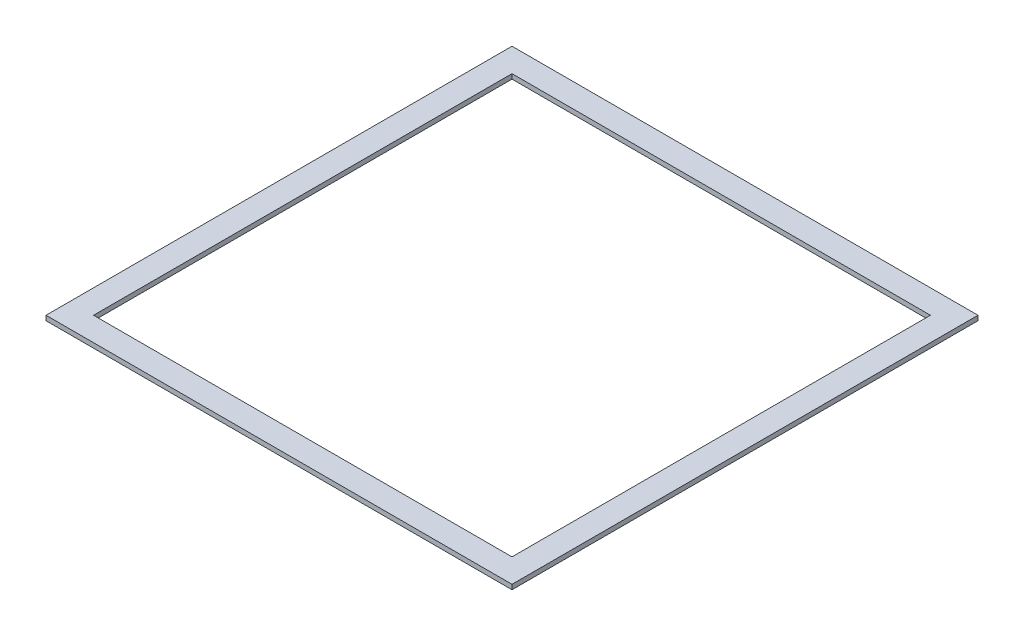
ISO-10303-21;
HEADER;
FILE_DESCRIPTION(('STEP AP214'),'2;1');
FILE_NAME('part.step','',(''),(''),'','','');
FILE_SCHEMA(('AUTOMOTIVE_DESIGN { 1 0 10303 214 1 1 1 1 }'));
ENDSEC;
DATA;
#1=APPLICATION_CONTEXT('core data for automotive mechanical design processes');
#2=APPLICATION_PROTOCOL_DEFINITION('international standard','automotive_design',2000,#1);
#3=PRODUCT_CONTEXT('',#1,'mechanical');
#4=PRODUCT('Part','Part','',(#3));
#5=PRODUCT_RELATED_PRODUCT_CATEGORY('part','',(#4));
#6=PRODUCT_DEFINITION_FORMATION('','',#4);
#7=PRODUCT_DEFINITION_CONTEXT('part definition',#1,'design');
#8=PRODUCT_DEFINITION('design','',#6,#7);
#9=PRODUCT_DEFINITION_SHAPE('','',#8);
#10=(LENGTH_UNIT() NAMED_UNIT(*) SI_UNIT(.MILLI.,.METRE.));
#11=(NAMED_UNIT(*) PLANE_ANGLE_UNIT() SI_UNIT($,.RADIAN.));
#12=(NAMED_UNIT(*) SI_UNIT($,.STERADIAN.) SOLID_ANGLE_UNIT());
#13=UNCERTAINTY_MEASURE_WITH_UNIT(LENGTH_MEASURE(1.E-05),#10,'distance_accuracy_value','');
#14=(GEOMETRIC_REPRESENTATION_CONTEXT(3) GLOBAL_UNCERTAINTY_ASSIGNED_CONTEXT((#13)) GLOBAL_UNIT_ASSIGNED_CONTEXT((#10,
#11,#12)) REPRESENTATION_CONTEXT('',''));
#15=CARTESIAN_POINT('',(0.,0.,0.));
#16=DIRECTION('',(0.,0.,1.));
#17=DIRECTION('',(1.,0.,0.));
#18=AXIS2_PLACEMENT_3D('',#15,#16,#17);
#19=CARTESIAN_POINT('',(0.,1.,0.));
#20=DIRECTION('',(0.,-1.,0.));
#21=DIRECTION('',(0.,0.,-1.));
#22=AXIS2_PLACEMENT_3D('',#19,#20,#21);
#23=PLANE('',#22);
#24=DIRECTION('',(0.,0.,1.));
#25=VECTOR('',#24,1.);
#26=CARTESIAN_POINT('',(0.,1.,0.));
#27=LINE('',#26,#25);
#28=CARTESIAN_POINT('',(0.,1.,-98.));
#29=VERTEX_POINT('',#28);
#30=CARTESIAN_POINT('',(0.,1.,0.));
#31=VERTEX_POINT('',#30);
#32=EDGE_CURVE('E134',#29,#31,#27,.T.);
#33=ORIENTED_EDGE('',*,*,#32,.T.);
#34=DIRECTION('',(1.,0.,0.));
#35=VECTOR('',#34,1.);
#36=CARTESIAN_POINT('',(0.,1.,0.));
#37=LINE('',#36,#35);
#38=CARTESIAN_POINT('',(98.,1.,0.));
#39=VERTEX_POINT('',#38);
#40=EDGE_CURVE('E137',#31,#39,#37,.T.);
#41=ORIENTED_EDGE('',*,*,#40,.T.);
#42=DIRECTION('',(0.,0.,-1.));
#43=VECTOR('',#42,1.);
#44=CARTESIAN_POINT('',(98.,1.,0.));
#45=LINE('',#44,#43);
#46=CARTESIAN_POINT('',(98.,1.,-98.));
#47=VERTEX_POINT('',#46);
#48=EDGE_CURVE('E140',#39,#47,#45,.T.);
#49=ORIENTED_EDGE('',*,*,#48,.T.);
#50=DIRECTION('',(-1.,0.,0.));
#51=VECTOR('',#50,1.);
#52=CARTESIAN_POINT('',(0.,1.,-98.));
#53=LINE('',#52,#51);
#54=EDGE_CURVE('E142',#47,#29,#53,.T.);
#55=ORIENTED_EDGE('',*,*,#54,.T.);
#56=EDGE_LOOP('',(#33,#41,#49,#55));
#57=FACE_BOUND('',#56,.T.);
#58=DIRECTION('',(1.,0.,0.));
#59=VECTOR('',#58,1.);
#60=CARTESIAN_POINT('',(5.,1.,-5.));
#61=LINE('',#60,#59);
#62=CARTESIAN_POINT('',(5.,1.,-5.));
#63=VERTEX_POINT('',#62);
#64=CARTESIAN_POINT('',(93.,1.,-5.));
#65=VERTEX_POINT('',#64);
#66=EDGE_CURVE('E98',#63,#65,#61,.T.);
#67=ORIENTED_EDGE('',*,*,#66,.F.);
#68=DIRECTION('',(0.,0.,1.));
#69=VECTOR('',#68,1.);
#70=CARTESIAN_POINT('',(5.,1.,-5.));
#71=LINE('',#70,#69);
#72=CARTESIAN_POINT('',(5.,1.,-93.));
#73=VERTEX_POINT('',#72);
#74=EDGE_CURVE('E120',#73,#63,#71,.T.);
#75=ORIENTED_EDGE('',*,*,#74,.F.);
#76=DIRECTION('',(-1.,0.,0.));
#77=VECTOR('',#76,1.);
#78=CARTESIAN_POINT('',(5.,1.,-93.));
#79=LINE('',#78,#77);
#80=CARTESIAN_POINT('',(93.,1.,-93.));
#81=VERTEX_POINT('',#80);
#82=EDGE_CURVE('E118',#81,#73,#79,.T.);
#83=ORIENTED_EDGE('',*,*,#82,.F.);
#84=DIRECTION('',(0.,0.,-1.));
#85=VECTOR('',#84,1.);
#86=CARTESIAN_POINT('',(93.,1.,-5.));
#87=LINE('',#86,#85);
#88=EDGE_CURVE('E106',#65,#81,#87,.T.);
#89=ORIENTED_EDGE('',*,*,#88,.F.);
#90=EDGE_LOOP('',(#67,#75,#83,#89));
#91=FACE_BOUND('',#90,.T.);
#92=ADVANCED_FACE('F33',(#57,#91),#23,.F.);
#93=CARTESIAN_POINT('',(0.,0.,0.));
#94=DIRECTION('',(0.,-1.,0.));
#95=DIRECTION('',(0.,0.,-1.));
#96=AXIS2_PLACEMENT_3D('',#93,#94,#95);
#97=PLANE('',#96);
#98=DIRECTION('',(0.,0.,1.));
#99=VECTOR('',#98,1.);
#100=CARTESIAN_POINT('',(0.,0.,0.));
#101=LINE('',#100,#99);
#102=CARTESIAN_POINT('',(0.,0.,-98.));
#103=VERTEX_POINT('',#102);
#104=CARTESIAN_POINT('',(0.,0.,0.));
#105=VERTEX_POINT('',#104);
#106=EDGE_CURVE('E114',#103,#105,#101,.T.);
#107=ORIENTED_EDGE('',*,*,#106,.F.);
#108=DIRECTION('',(-1.,0.,0.));
#109=VECTOR('',#108,1.);
#110=CARTESIAN_POINT('',(0.,0.,-98.));
#111=LINE('',#110,#109);
#112=CARTESIAN_POINT('',(98.,0.,-98.));
#113=VERTEX_POINT('',#112);
#114=EDGE_CURVE('E138',#113,#103,#111,.T.);
#115=ORIENTED_EDGE('',*,*,#114,.F.);
#116=DIRECTION('',(0.,0.,-1.));
#117=VECTOR('',#116,1.);
#118=CARTESIAN_POINT('',(98.,0.,0.));
#119=LINE('',#118,#117);
#120=CARTESIAN_POINT('',(98.,0.,0.));
#121=VERTEX_POINT('',#120);
#122=EDGE_CURVE('E149',#121,#113,#119,.T.);
#123=ORIENTED_EDGE('',*,*,#122,.F.);
#124=DIRECTION('',(1.,0.,0.));
#125=VECTOR('',#124,1.);
#126=CARTESIAN_POINT('',(0.,0.,0.));
#127=LINE('',#126,#125);
#128=EDGE_CURVE('E147',#105,#121,#127,.T.);
#129=ORIENTED_EDGE('',*,*,#128,.F.);
#130=EDGE_LOOP('',(#107,#115,#123,#129));
#131=FACE_BOUND('',#130,.T.);
#132=DIRECTION('',(0.,0.,1.));
#133=VECTOR('',#132,1.);
#134=CARTESIAN_POINT('',(5.,0.,-5.));
#135=LINE('',#134,#133);
#136=CARTESIAN_POINT('',(5.,0.,-93.));
#137=VERTEX_POINT('',#136);
#138=CARTESIAN_POINT('',(5.,0.,-5.));
#139=VERTEX_POINT('',#138);
#140=EDGE_CURVE('E107',#137,#139,#135,.T.);
#141=ORIENTED_EDGE('',*,*,#140,.T.);
#142=DIRECTION('',(1.,0.,0.));
#143=VECTOR('',#142,1.);
#144=CARTESIAN_POINT('',(5.,0.,-5.));
#145=LINE('',#144,#143);
#146=CARTESIAN_POINT('',(93.,0.,-5.));
#147=VERTEX_POINT('',#146);
#148=EDGE_CURVE('E56',#139,#147,#145,.T.);
#149=ORIENTED_EDGE('',*,*,#148,.T.);
#150=DIRECTION('',(0.,0.,-1.));
#151=VECTOR('',#150,1.);
#152=CARTESIAN_POINT('',(93.,0.,-5.));
#153=LINE('',#152,#151);
#154=CARTESIAN_POINT('',(93.,0.,-93.));
#155=VERTEX_POINT('',#154);
#156=EDGE_CURVE('E113',#147,#155,#153,.T.);
#157=ORIENTED_EDGE('',*,*,#156,.T.);
#158=DIRECTION('',(-1.,0.,0.));
#159=VECTOR('',#158,1.);
#160=CARTESIAN_POINT('',(5.,0.,-93.));
#161=LINE('',#160,#159);
#162=EDGE_CURVE('E126',#155,#137,#161,.T.);
#163=ORIENTED_EDGE('',*,*,#162,.T.);
#164=EDGE_LOOP('',(#141,#149,#157,#163));
#165=FACE_BOUND('',#164,.T.);
#166=ADVANCED_FACE('F167',(#131,#165),#97,.T.);
#167=CARTESIAN_POINT('',(0.,1.,0.));
#168=DIRECTION('',(1.,0.,0.));
#169=DIRECTION('',(0.,0.,-1.));
#170=AXIS2_PLACEMENT_3D('',#167,#168,#169);
#171=PLANE('',#170);
#172=ORIENTED_EDGE('',*,*,#106,.T.);
#173=DIRECTION('',(0.,-1.,0.));
#174=VECTOR('',#173,1.);
#175=CARTESIAN_POINT('',(0.,1.,0.));
#176=LINE('',#175,#174);
#177=EDGE_CURVE('E11',#31,#105,#176,.T.);
#178=ORIENTED_EDGE('',*,*,#177,.F.);
#179=ORIENTED_EDGE('',*,*,#32,.F.);
#180=DIRECTION('',(0.,-1.,0.));
#181=VECTOR('',#180,1.);
#182=CARTESIAN_POINT('',(0.,1.,-98.));
#183=LINE('',#182,#181);
#184=EDGE_CURVE('E144',#29,#103,#183,.T.);
#185=ORIENTED_EDGE('',*,*,#184,.T.);
#186=EDGE_LOOP('',(#172,#178,#179,#185));
#187=FACE_BOUND('',#186,.T.);
#188=ADVANCED_FACE('F35',(#187),#171,.F.);
#189=CARTESIAN_POINT('',(0.,1.,0.));
#190=DIRECTION('',(0.,0.,-1.));
#191=DIRECTION('',(-1.,0.,0.));
#192=AXIS2_PLACEMENT_3D('',#189,#190,#191);
#193=PLANE('',#192);
#194=ORIENTED_EDGE('',*,*,#128,.T.);
#195=DIRECTION('',(0.,-1.,0.));
#196=VECTOR('',#195,1.);
#197=CARTESIAN_POINT('',(98.,1.,0.));
#198=LINE('',#197,#196);
#199=EDGE_CURVE('E41',#39,#121,#198,.T.);
#200=ORIENTED_EDGE('',*,*,#199,.F.);
#201=ORIENTED_EDGE('',*,*,#40,.F.);
#202=ORIENTED_EDGE('',*,*,#177,.T.);
#203=EDGE_LOOP('',(#194,#200,#201,#202));
#204=FACE_BOUND('',#203,.T.);
#205=ADVANCED_FACE('F177',(#204),#193,.F.);
#206=CARTESIAN_POINT('',(98.,1.,0.));
#207=DIRECTION('',(-1.,0.,0.));
#208=DIRECTION('',(0.,0.,1.));
#209=AXIS2_PLACEMENT_3D('',#206,#207,#208);
#210=PLANE('',#209);
#211=ORIENTED_EDGE('',*,*,#122,.T.);
#212=DIRECTION('',(0.,-1.,0.));
#213=VECTOR('',#212,1.);
#214=CARTESIAN_POINT('',(98.,1.,-98.));
#215=LINE('',#214,#213);
#216=EDGE_CURVE('E154',#47,#113,#215,.T.);
#217=ORIENTED_EDGE('',*,*,#216,.F.);
#218=ORIENTED_EDGE('',*,*,#48,.F.);
#219=ORIENTED_EDGE('',*,*,#199,.T.);
#220=EDGE_LOOP('',(#211,#217,#218,#219));
#221=FACE_BOUND('',#220,.T.);
#222=ADVANCED_FACE('F161',(#221),#210,.F.);
#223=CARTESIAN_POINT('',(0.,1.,-98.));
#224=DIRECTION('',(0.,0.,1.));
#225=DIRECTION('',(1.,0.,0.));
#226=AXIS2_PLACEMENT_3D('',#223,#224,#225);
#227=PLANE('',#226);
#228=ORIENTED_EDGE('',*,*,#114,.T.);
#229=ORIENTED_EDGE('',*,*,#184,.F.);
#230=ORIENTED_EDGE('',*,*,#54,.F.);
#231=ORIENTED_EDGE('',*,*,#216,.T.);
#232=EDGE_LOOP('',(#228,#229,#230,#231));
#233=FACE_BOUND('',#232,.T.);
#234=ADVANCED_FACE('F171',(#233),#227,.F.);
#235=CARTESIAN_POINT('',(5.,1.,-5.));
#236=DIRECTION('',(0.,0.,-1.));
#237=DIRECTION('',(-1.,0.,0.));
#238=AXIS2_PLACEMENT_3D('',#235,#236,#237);
#239=PLANE('',#238);
#240=ORIENTED_EDGE('',*,*,#148,.F.);
#241=DIRECTION('',(0.,-1.,0.));
#242=VECTOR('',#241,1.);
#243=CARTESIAN_POINT('',(5.,1.,-5.));
#244=LINE('',#243,#242);
#245=EDGE_CURVE('E102',#63,#139,#244,.T.);
#246=ORIENTED_EDGE('',*,*,#245,.F.);
#247=ORIENTED_EDGE('',*,*,#66,.T.);
#248=DIRECTION('',(0.,-1.,0.));
#249=VECTOR('',#248,1.);
#250=CARTESIAN_POINT('',(93.,1.,-5.));
#251=LINE('',#250,#249);
#252=EDGE_CURVE('E101',#65,#147,#251,.T.);
#253=ORIENTED_EDGE('',*,*,#252,.T.);
#254=EDGE_LOOP('',(#240,#246,#247,#253));
#255=FACE_BOUND('',#254,.T.);
#256=ADVANCED_FACE('F100',(#255),#239,.T.);
#257=CARTESIAN_POINT('',(93.,1.,-5.));
#258=DIRECTION('',(-1.,0.,0.));
#259=DIRECTION('',(0.,0.,1.));
#260=AXIS2_PLACEMENT_3D('',#257,#258,#259);
#261=PLANE('',#260);
#262=ORIENTED_EDGE('',*,*,#156,.F.);
#263=ORIENTED_EDGE('',*,*,#252,.F.);
#264=ORIENTED_EDGE('',*,*,#88,.T.);
#265=DIRECTION('',(0.,-1.,0.));
#266=VECTOR('',#265,1.);
#267=CARTESIAN_POINT('',(93.,1.,-93.));
#268=LINE('',#267,#266);
#269=EDGE_CURVE('E115',#81,#155,#268,.T.);
#270=ORIENTED_EDGE('',*,*,#269,.T.);
#271=EDGE_LOOP('',(#262,#263,#264,#270));
#272=FACE_BOUND('',#271,.T.);
#273=ADVANCED_FACE('F110',(#272),#261,.T.);
#274=CARTESIAN_POINT('',(5.,1.,-93.));
#275=DIRECTION('',(0.,0.,1.));
#276=DIRECTION('',(1.,0.,0.));
#277=AXIS2_PLACEMENT_3D('',#274,#275,#276);
#278=PLANE('',#277);
#279=ORIENTED_EDGE('',*,*,#162,.F.);
#280=ORIENTED_EDGE('',*,*,#269,.F.);
#281=ORIENTED_EDGE('',*,*,#82,.T.);
#282=DIRECTION('',(0.,-1.,0.));
#283=VECTOR('',#282,1.);
#284=CARTESIAN_POINT('',(5.,1.,-93.));
#285=LINE('',#284,#283);
#286=EDGE_CURVE('E48',#73,#137,#285,.T.);
#287=ORIENTED_EDGE('',*,*,#286,.T.);
#288=EDGE_LOOP('',(#279,#280,#281,#287));
#289=FACE_BOUND('',#288,.T.);
#290=ADVANCED_FACE('F200',(#289),#278,.T.);
#291=CARTESIAN_POINT('',(5.,1.,-5.));
#292=DIRECTION('',(1.,0.,0.));
#293=DIRECTION('',(0.,0.,-1.));
#294=AXIS2_PLACEMENT_3D('',#291,#292,#293);
#295=PLANE('',#294);
#296=ORIENTED_EDGE('',*,*,#140,.F.);
#297=ORIENTED_EDGE('',*,*,#286,.F.);
#298=ORIENTED_EDGE('',*,*,#74,.T.);
#299=ORIENTED_EDGE('',*,*,#245,.T.);
#300=EDGE_LOOP('',(#296,#297,#298,#299));
#301=FACE_BOUND('',#300,.T.);
#302=ADVANCED_FACE('F204',(#301),#295,.T.);
#303=CLOSED_SHELL('',(#92,#166,#188,#205,#222,#234,#256,#273,#290,#302));
#304=MANIFOLD_SOLID_BREP('B2',#303);
#305=ADVANCED_BREP_SHAPE_REPRESENTATION('',(#18,#304),#14);
#306=SHAPE_DEFINITION_REPRESENTATION(#9,#305);
ENDSEC;
END-ISO-10303-21;
